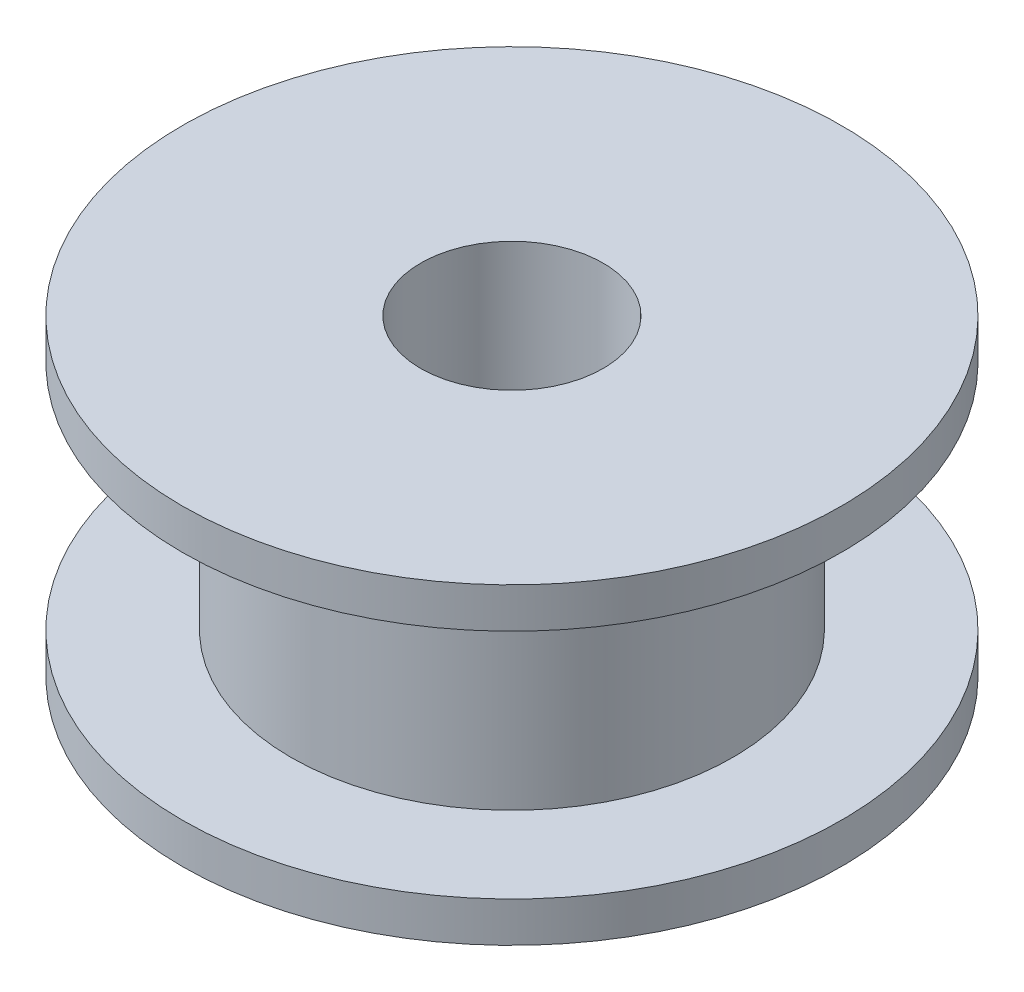
ISO-10303-21;
HEADER;
FILE_DESCRIPTION(('STEP AP214'),'2;1');
FILE_NAME('part.step','',(''),(''),'','','');
FILE_SCHEMA(('AUTOMOTIVE_DESIGN { 1 0 10303 214 1 1 1 1 }'));
ENDSEC;
DATA;
#1=APPLICATION_CONTEXT('core data for automotive mechanical design processes');
#2=APPLICATION_PROTOCOL_DEFINITION('international standard','automotive_design',2000,#1);
#3=PRODUCT_CONTEXT('',#1,'mechanical');
#4=PRODUCT('Part','Part','',(#3));
#5=PRODUCT_RELATED_PRODUCT_CATEGORY('part','',(#4));
#6=PRODUCT_DEFINITION_FORMATION('','',#4);
#7=PRODUCT_DEFINITION_CONTEXT('part definition',#1,'design');
#8=PRODUCT_DEFINITION('design','',#6,#7);
#9=PRODUCT_DEFINITION_SHAPE('','',#8);
#10=(LENGTH_UNIT() NAMED_UNIT(*) SI_UNIT(.MILLI.,.METRE.));
#11=(NAMED_UNIT(*) PLANE_ANGLE_UNIT() SI_UNIT($,.RADIAN.));
#12=(NAMED_UNIT(*) SI_UNIT($,.STERADIAN.) SOLID_ANGLE_UNIT());
#13=UNCERTAINTY_MEASURE_WITH_UNIT(LENGTH_MEASURE(1.E-05),#10,'distance_accuracy_value','');
#14=(GEOMETRIC_REPRESENTATION_CONTEXT(3) GLOBAL_UNCERTAINTY_ASSIGNED_CONTEXT((#13)) GLOBAL_UNIT_ASSIGNED_CONTEXT((#10,
#11,#12)) REPRESENTATION_CONTEXT('',''));
#15=CARTESIAN_POINT('',(0.,0.,0.));
#16=DIRECTION('',(0.,0.,1.));
#17=DIRECTION('',(1.,0.,0.));
#18=AXIS2_PLACEMENT_3D('',#15,#16,#17);
#19=CARTESIAN_POINT('',(0.,6.35,0.));
#20=DIRECTION('',(0.,-1.,0.));
#21=DIRECTION('',(0.,0.,-1.));
#22=AXIS2_PLACEMENT_3D('',#19,#20,#21);
#23=CYLINDRICAL_SURFACE('',#22,6.05);
#24=CARTESIAN_POINT('',(0.,6.35,0.));
#25=DIRECTION('',(0.,1.,0.));
#26=DIRECTION('',(0.,0.,1.));
#27=AXIS2_PLACEMENT_3D('',#24,#25,#26);
#28=CIRCLE('',#27,6.05);
#29=CARTESIAN_POINT('',(0.,6.35,6.05));
#30=VERTEX_POINT('',#29);
#31=EDGE_CURVE('E10',#30,#30,#28,.T.);
#32=ORIENTED_EDGE('',*,*,#31,.F.);
#33=EDGE_LOOP('',(#32));
#34=FACE_BOUND('',#33,.T.);
#35=CARTESIAN_POINT('',(0.,0.,0.));
#36=DIRECTION('',(0.,1.,0.));
#37=DIRECTION('',(0.,0.,1.));
#38=AXIS2_PLACEMENT_3D('',#35,#36,#37);
#39=CIRCLE('',#38,6.05);
#40=CARTESIAN_POINT('',(0.,0.,6.05));
#41=VERTEX_POINT('',#40);
#42=EDGE_CURVE('E36',#41,#41,#39,.T.);
#43=ORIENTED_EDGE('',*,*,#42,.T.);
#44=EDGE_LOOP('',(#43));
#45=FACE_BOUND('',#44,.T.);
#46=ADVANCED_FACE('F30',(#34,#45),#23,.T.);
#47=CARTESIAN_POINT('',(0.,-1.1,0.));
#48=DIRECTION('',(0.,1.,0.));
#49=DIRECTION('',(0.,0.,1.));
#50=AXIS2_PLACEMENT_3D('',#47,#48,#49);
#51=CYLINDRICAL_SURFACE('',#50,9.025);
#52=CARTESIAN_POINT('',(0.,-1.1,0.));
#53=DIRECTION('',(0.,1.,0.));
#54=DIRECTION('',(0.,0.,1.));
#55=AXIS2_PLACEMENT_3D('',#52,#53,#54);
#56=CIRCLE('',#55,9.025);
#57=CARTESIAN_POINT('',(0.,-1.1,9.025));
#58=VERTEX_POINT('',#57);
#59=EDGE_CURVE('E40',#58,#58,#56,.T.);
#60=ORIENTED_EDGE('',*,*,#59,.T.);
#61=EDGE_LOOP('',(#60));
#62=FACE_BOUND('',#61,.T.);
#63=CARTESIAN_POINT('',(0.,0.,0.));
#64=DIRECTION('',(0.,1.,0.));
#65=DIRECTION('',(0.,0.,1.));
#66=AXIS2_PLACEMENT_3D('',#63,#64,#65);
#67=CIRCLE('',#66,9.025);
#68=CARTESIAN_POINT('',(0.,0.,9.025));
#69=VERTEX_POINT('',#68);
#70=EDGE_CURVE('E44',#69,#69,#67,.T.);
#71=ORIENTED_EDGE('',*,*,#70,.F.);
#72=EDGE_LOOP('',(#71));
#73=FACE_BOUND('',#72,.T.);
#74=ADVANCED_FACE('F86',(#62,#73),#51,.T.);
#75=CARTESIAN_POINT('',(0.,-1.1,0.));
#76=DIRECTION('',(0.,1.,0.));
#77=DIRECTION('',(0.,0.,1.));
#78=AXIS2_PLACEMENT_3D('',#75,#76,#77);
#79=PLANE('',#78);
#80=CARTESIAN_POINT('',(0.,-1.1,0.));
#81=DIRECTION('',(0.,1.,0.));
#82=DIRECTION('',(0.,0.,1.));
#83=AXIS2_PLACEMENT_3D('',#80,#81,#82);
#84=CIRCLE('',#83,2.5);
#85=CARTESIAN_POINT('',(0.,-1.1,2.5));
#86=VERTEX_POINT('',#85);
#87=EDGE_CURVE('E53',#86,#86,#84,.F.);
#88=ORIENTED_EDGE('',*,*,#87,.F.);
#89=EDGE_LOOP('',(#88));
#90=FACE_BOUND('',#89,.T.);
#91=ORIENTED_EDGE('',*,*,#59,.F.);
#92=EDGE_LOOP('',(#91));
#93=FACE_BOUND('',#92,.T.);
#94=ADVANCED_FACE('F91',(#90,#93),#79,.F.);
#95=CARTESIAN_POINT('',(0.,0.,0.));
#96=DIRECTION('',(0.,1.,0.));
#97=DIRECTION('',(0.,0.,1.));
#98=AXIS2_PLACEMENT_3D('',#95,#96,#97);
#99=PLANE('',#98);
#100=ORIENTED_EDGE('',*,*,#42,.F.);
#101=EDGE_LOOP('',(#100));
#102=FACE_BOUND('',#101,.T.);
#103=ORIENTED_EDGE('',*,*,#70,.T.);
#104=EDGE_LOOP('',(#103));
#105=FACE_BOUND('',#104,.T.);
#106=ADVANCED_FACE('F75',(#102,#105),#99,.T.);
#107=CARTESIAN_POINT('',(0.,7.45,0.));
#108=DIRECTION('',(0.,-1.,0.));
#109=DIRECTION('',(0.,0.,-1.));
#110=AXIS2_PLACEMENT_3D('',#107,#108,#109);
#111=CYLINDRICAL_SURFACE('',#110,9.025);
#112=CARTESIAN_POINT('',(0.,7.45,0.));
#113=DIRECTION('',(0.,1.,0.));
#114=DIRECTION('',(0.,0.,1.));
#115=AXIS2_PLACEMENT_3D('',#112,#113,#114);
#116=CIRCLE('',#115,9.025);
#117=CARTESIAN_POINT('',(0.,7.45,9.025));
#118=VERTEX_POINT('',#117);
#119=EDGE_CURVE('E48',#118,#118,#116,.T.);
#120=ORIENTED_EDGE('',*,*,#119,.F.);
#121=EDGE_LOOP('',(#120));
#122=FACE_BOUND('',#121,.T.);
#123=CARTESIAN_POINT('',(0.,6.35,0.));
#124=DIRECTION('',(0.,1.,0.));
#125=DIRECTION('',(0.,0.,1.));
#126=AXIS2_PLACEMENT_3D('',#123,#124,#125);
#127=CIRCLE('',#126,9.025);
#128=CARTESIAN_POINT('',(0.,6.35,9.025));
#129=VERTEX_POINT('',#128);
#130=EDGE_CURVE('E50',#129,#129,#127,.T.);
#131=ORIENTED_EDGE('',*,*,#130,.T.);
#132=EDGE_LOOP('',(#131));
#133=FACE_BOUND('',#132,.T.);
#134=ADVANCED_FACE('F69',(#122,#133),#111,.T.);
#135=CARTESIAN_POINT('',(0.,7.45,0.));
#136=DIRECTION('',(0.,1.,0.));
#137=DIRECTION('',(0.,0.,1.));
#138=AXIS2_PLACEMENT_3D('',#135,#136,#137);
#139=PLANE('',#138);
#140=CARTESIAN_POINT('',(0.,7.45,0.));
#141=DIRECTION('',(0.,1.,0.));
#142=DIRECTION('',(0.,0.,1.));
#143=AXIS2_PLACEMENT_3D('',#140,#141,#142);
#144=CIRCLE('',#143,2.5);
#145=CARTESIAN_POINT('',(0.,7.45,2.5));
#146=VERTEX_POINT('',#145);
#147=EDGE_CURVE('E58',#146,#146,#144,.T.);
#148=ORIENTED_EDGE('',*,*,#147,.F.);
#149=EDGE_LOOP('',(#148));
#150=FACE_BOUND('',#149,.T.);
#151=ORIENTED_EDGE('',*,*,#119,.T.);
#152=EDGE_LOOP('',(#151));
#153=FACE_BOUND('',#152,.T.);
#154=ADVANCED_FACE('F65',(#150,#153),#139,.T.);
#155=CARTESIAN_POINT('',(0.,6.35,0.));
#156=DIRECTION('',(0.,1.,0.));
#157=DIRECTION('',(0.,0.,1.));
#158=AXIS2_PLACEMENT_3D('',#155,#156,#157);
#159=PLANE('',#158);
#160=ORIENTED_EDGE('',*,*,#31,.T.);
#161=EDGE_LOOP('',(#160));
#162=FACE_BOUND('',#161,.T.);
#163=ORIENTED_EDGE('',*,*,#130,.F.);
#164=EDGE_LOOP('',(#163));
#165=FACE_BOUND('',#164,.T.);
#166=ADVANCED_FACE('F68',(#162,#165),#159,.F.);
#167=CARTESIAN_POINT('',(0.,-1.101,0.));
#168=DIRECTION('',(0.,1.,0.));
#169=DIRECTION('',(0.,0.,1.));
#170=AXIS2_PLACEMENT_3D('',#167,#168,#169);
#171=CYLINDRICAL_SURFACE('',#170,2.5);
#172=ORIENTED_EDGE('',*,*,#147,.T.);
#173=EDGE_LOOP('',(#172));
#174=FACE_BOUND('',#173,.T.);
#175=ORIENTED_EDGE('',*,*,#87,.T.);
#176=EDGE_LOOP('',(#175));
#177=FACE_BOUND('',#176,.T.);
#178=ADVANCED_FACE('F62',(#174,#177),#171,.F.);
#179=CLOSED_SHELL('',(#46,#74,#94,#106,#134,#154,#166,#178));
#180=MANIFOLD_SOLID_BREP('B2',#179);
#181=ADVANCED_BREP_SHAPE_REPRESENTATION('',(#18,#180),#14);
#182=SHAPE_DEFINITION_REPRESENTATION(#9,#181);
ENDSEC;
END-ISO-10303-21;
